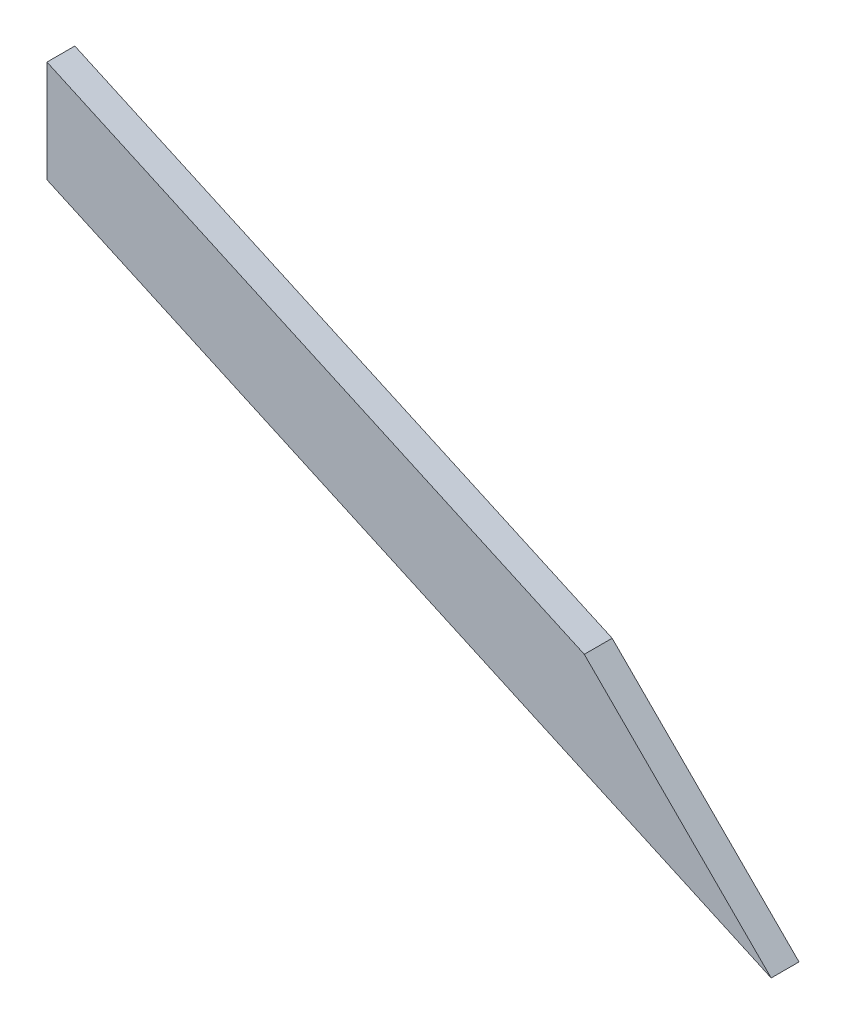
ISO-10303-21;
HEADER;
FILE_DESCRIPTION(('STEP AP214'),'2;1');
FILE_NAME('part.step','',(''),(''),'','','');
FILE_SCHEMA(('AUTOMOTIVE_DESIGN { 1 0 10303 214 1 1 1 1 }'));
ENDSEC;
DATA;
#1=APPLICATION_CONTEXT('core data for automotive mechanical design processes');
#2=APPLICATION_PROTOCOL_DEFINITION('international standard','automotive_design',2000,#1);
#3=PRODUCT_CONTEXT('',#1,'mechanical');
#4=PRODUCT('Part','Part','',(#3));
#5=PRODUCT_RELATED_PRODUCT_CATEGORY('part','',(#4));
#6=PRODUCT_DEFINITION_FORMATION('','',#4);
#7=PRODUCT_DEFINITION_CONTEXT('part definition',#1,'design');
#8=PRODUCT_DEFINITION('design','',#6,#7);
#9=PRODUCT_DEFINITION_SHAPE('','',#8);
#10=(LENGTH_UNIT() NAMED_UNIT(*) SI_UNIT(.MILLI.,.METRE.));
#11=(NAMED_UNIT(*) PLANE_ANGLE_UNIT() SI_UNIT($,.RADIAN.));
#12=(NAMED_UNIT(*) SI_UNIT($,.STERADIAN.) SOLID_ANGLE_UNIT());
#13=UNCERTAINTY_MEASURE_WITH_UNIT(LENGTH_MEASURE(1.E-05),#10,'distance_accuracy_value','');
#14=(GEOMETRIC_REPRESENTATION_CONTEXT(3) GLOBAL_UNCERTAINTY_ASSIGNED_CONTEXT((#13)) GLOBAL_UNIT_ASSIGNED_CONTEXT((#10,
#11,#12)) REPRESENTATION_CONTEXT('',''));
#15=CARTESIAN_POINT('',(0.,0.,0.));
#16=DIRECTION('',(0.,0.,1.));
#17=DIRECTION('',(1.,0.,0.));
#18=AXIS2_PLACEMENT_3D('',#15,#16,#17);
#19=CARTESIAN_POINT('',(-737.184498249528,1692.9410335188,19.05));
#20=DIRECTION('',(0.413802944301184,0.910366477462605,0.));
#21=DIRECTION('',(-0.910366477462605,0.413802944301184,0.));
#22=AXIS2_PLACEMENT_3D('',#19,#20,#21);
#23=PLANE('',#22);
#24=DIRECTION('',(0.910366477462605,-0.413802944301184,0.));
#25=VECTOR('',#24,1.);
#26=CARTESIAN_POINT('',(-737.184498249528,1692.9410335188,0.));
#27=LINE('',#26,#25);
#28=CARTESIAN_POINT('',(-737.184498249528,1692.9410335188,0.));
#29=VERTEX_POINT('',#28);
#30=CARTESIAN_POINT('',(-241.6309931892,1467.68944030956,0.));
#31=VERTEX_POINT('',#30);
#32=EDGE_CURVE('E98',#29,#31,#27,.T.);
#33=ORIENTED_EDGE('',*,*,#32,.T.);
#34=DIRECTION('',(0.,0.,-1.));
#35=VECTOR('',#34,1.);
#36=CARTESIAN_POINT('',(-241.6309931892,1467.68944030956,19.05));
#37=LINE('',#36,#35);
#38=CARTESIAN_POINT('',(-241.6309931892,1467.68944030956,19.05));
#39=VERTEX_POINT('',#38);
#40=EDGE_CURVE('E11',#39,#31,#37,.T.);
#41=ORIENTED_EDGE('',*,*,#40,.F.);
#42=DIRECTION('',(0.910366477462605,-0.413802944301184,0.));
#43=VECTOR('',#42,1.);
#44=CARTESIAN_POINT('',(-737.184498249528,1692.9410335188,19.05));
#45=LINE('',#44,#43);
#46=CARTESIAN_POINT('',(-737.184498249528,1692.9410335188,19.05));
#47=VERTEX_POINT('',#46);
#48=EDGE_CURVE('E86',#47,#39,#45,.T.);
#49=ORIENTED_EDGE('',*,*,#48,.F.);
#50=DIRECTION('',(0.,0.,-1.));
#51=VECTOR('',#50,1.);
#52=CARTESIAN_POINT('',(-737.184498249528,1692.9410335188,19.05));
#53=LINE('',#52,#51);
#54=EDGE_CURVE('E94',#47,#29,#53,.T.);
#55=ORIENTED_EDGE('',*,*,#54,.T.);
#56=EDGE_LOOP('',(#33,#41,#49,#55));
#57=FACE_BOUND('',#56,.T.);
#58=ADVANCED_FACE('F35',(#57),#23,.F.);
#59=CARTESIAN_POINT('',(-241.6309931892,1467.68944030956,19.05));
#60=DIRECTION('',(-0.707106781186546,-0.707106781186549,0.));
#61=DIRECTION('',(0.707106781186549,-0.707106781186546,0.));
#62=AXIS2_PLACEMENT_3D('',#59,#60,#61);
#63=PLANE('',#62);
#64=DIRECTION('',(-0.707106781186549,0.707106781186546,0.));
#65=VECTOR('',#64,1.);
#66=CARTESIAN_POINT('',(-241.6309931892,1467.68944030956,0.));
#67=LINE('',#66,#65);
#68=CARTESIAN_POINT('',(-369.509896409745,1595.5683435301,0.));
#69=VERTEX_POINT('',#68);
#70=EDGE_CURVE('E90',#31,#69,#67,.T.);
#71=ORIENTED_EDGE('',*,*,#70,.T.);
#72=DIRECTION('',(0.,0.,-1.));
#73=VECTOR('',#72,1.);
#74=CARTESIAN_POINT('',(-369.509896409745,1595.5683435301,19.05));
#75=LINE('',#74,#73);
#76=CARTESIAN_POINT('',(-369.509896409745,1595.5683435301,19.05));
#77=VERTEX_POINT('',#76);
#78=EDGE_CURVE('E43',#77,#69,#75,.T.);
#79=ORIENTED_EDGE('',*,*,#78,.F.);
#80=DIRECTION('',(-0.707106781186549,0.707106781186546,0.));
#81=VECTOR('',#80,1.);
#82=CARTESIAN_POINT('',(-241.6309931892,1467.68944030956,19.05));
#83=LINE('',#82,#81);
#84=EDGE_CURVE('E81',#39,#77,#83,.T.);
#85=ORIENTED_EDGE('',*,*,#84,.F.);
#86=ORIENTED_EDGE('',*,*,#40,.T.);
#87=EDGE_LOOP('',(#71,#79,#85,#86));
#88=FACE_BOUND('',#87,.T.);
#89=ADVANCED_FACE('F89',(#88),#63,.F.);
#90=CARTESIAN_POINT('',(-737.184498249528,1762.69316254818,19.05));
#91=DIRECTION('',(-0.413802944301181,-0.910366477462606,0.));
#92=DIRECTION('',(0.910366477462606,-0.413802944301181,0.));
#93=AXIS2_PLACEMENT_3D('',#90,#91,#92);
#94=PLANE('',#93);
#95=DIRECTION('',(-0.910366477462606,0.413802944301181,0.));
#96=VECTOR('',#95,1.);
#97=CARTESIAN_POINT('',(-737.184498249528,1762.69316254818,0.));
#98=LINE('',#97,#96);
#99=CARTESIAN_POINT('',(-737.184498249528,1762.69316254818,0.));
#100=VERTEX_POINT('',#99);
#101=EDGE_CURVE('E68',#69,#100,#98,.T.);
#102=ORIENTED_EDGE('',*,*,#101,.T.);
#103=DIRECTION('',(0.,0.,-1.));
#104=VECTOR('',#103,1.);
#105=CARTESIAN_POINT('',(-737.184498249528,1762.69316254818,19.05));
#106=LINE('',#105,#104);
#107=CARTESIAN_POINT('',(-737.184498249528,1762.69316254818,19.05));
#108=VERTEX_POINT('',#107);
#109=EDGE_CURVE('E91',#108,#100,#106,.T.);
#110=ORIENTED_EDGE('',*,*,#109,.F.);
#111=DIRECTION('',(-0.910366477462606,0.413802944301181,0.));
#112=VECTOR('',#111,1.);
#113=CARTESIAN_POINT('',(-737.184498249528,1762.69316254818,19.05));
#114=LINE('',#113,#112);
#115=EDGE_CURVE('E84',#77,#108,#114,.T.);
#116=ORIENTED_EDGE('',*,*,#115,.F.);
#117=ORIENTED_EDGE('',*,*,#78,.T.);
#118=EDGE_LOOP('',(#102,#110,#116,#117));
#119=FACE_BOUND('',#118,.T.);
#120=ADVANCED_FACE('F92',(#119),#94,.F.);
#121=CARTESIAN_POINT('',(-737.184498249528,1692.9410335188,19.05));
#122=DIRECTION('',(1.,0.,0.));
#123=DIRECTION('',(0.,0.,-1.));
#124=AXIS2_PLACEMENT_3D('',#121,#122,#123);
#125=PLANE('',#124);
#126=DIRECTION('',(0.,-1.,0.));
#127=VECTOR('',#126,1.);
#128=CARTESIAN_POINT('',(-737.184498249528,1692.9410335188,0.));
#129=LINE('',#128,#127);
#130=EDGE_CURVE('E74',#100,#29,#129,.T.);
#131=ORIENTED_EDGE('',*,*,#130,.T.);
#132=ORIENTED_EDGE('',*,*,#54,.F.);
#133=DIRECTION('',(0.,-1.,0.));
#134=VECTOR('',#133,1.);
#135=CARTESIAN_POINT('',(-737.184498249528,1692.9410335188,19.05));
#136=LINE('',#135,#134);
#137=EDGE_CURVE('E51',#108,#47,#136,.T.);
#138=ORIENTED_EDGE('',*,*,#137,.F.);
#139=ORIENTED_EDGE('',*,*,#109,.T.);
#140=EDGE_LOOP('',(#131,#132,#138,#139));
#141=FACE_BOUND('',#140,.T.);
#142=ADVANCED_FACE('F105',(#141),#125,.F.);
#143=CARTESIAN_POINT('',(0.,0.,19.05));
#144=DIRECTION('',(0.,0.,1.));
#145=DIRECTION('',(1.,0.,0.));
#146=AXIS2_PLACEMENT_3D('',#143,#144,#145);
#147=PLANE('',#146);
#148=ORIENTED_EDGE('',*,*,#48,.T.);
#149=ORIENTED_EDGE('',*,*,#84,.T.);
#150=ORIENTED_EDGE('',*,*,#115,.T.);
#151=ORIENTED_EDGE('',*,*,#137,.T.);
#152=EDGE_LOOP('',(#148,#149,#150,#151));
#153=FACE_BOUND('',#152,.T.);
#154=ADVANCED_FACE('F82',(#153),#147,.T.);
#155=CARTESIAN_POINT('',(0.,0.,0.));
#156=DIRECTION('',(0.,0.,1.));
#157=DIRECTION('',(1.,0.,0.));
#158=AXIS2_PLACEMENT_3D('',#155,#156,#157);
#159=PLANE('',#158);
#160=ORIENTED_EDGE('',*,*,#32,.F.);
#161=ORIENTED_EDGE('',*,*,#130,.F.);
#162=ORIENTED_EDGE('',*,*,#101,.F.);
#163=ORIENTED_EDGE('',*,*,#70,.F.);
#164=EDGE_LOOP('',(#160,#161,#162,#163));
#165=FACE_BOUND('',#164,.T.);
#166=ADVANCED_FACE('F108',(#165),#159,.F.);
#167=CLOSED_SHELL('',(#58,#89,#120,#142,#154,#166));
#168=MANIFOLD_SOLID_BREP('B2',#167);
#169=ADVANCED_BREP_SHAPE_REPRESENTATION('',(#18,#168),#14);
#170=SHAPE_DEFINITION_REPRESENTATION(#9,#169);
ENDSEC;
END-ISO-10303-21;
